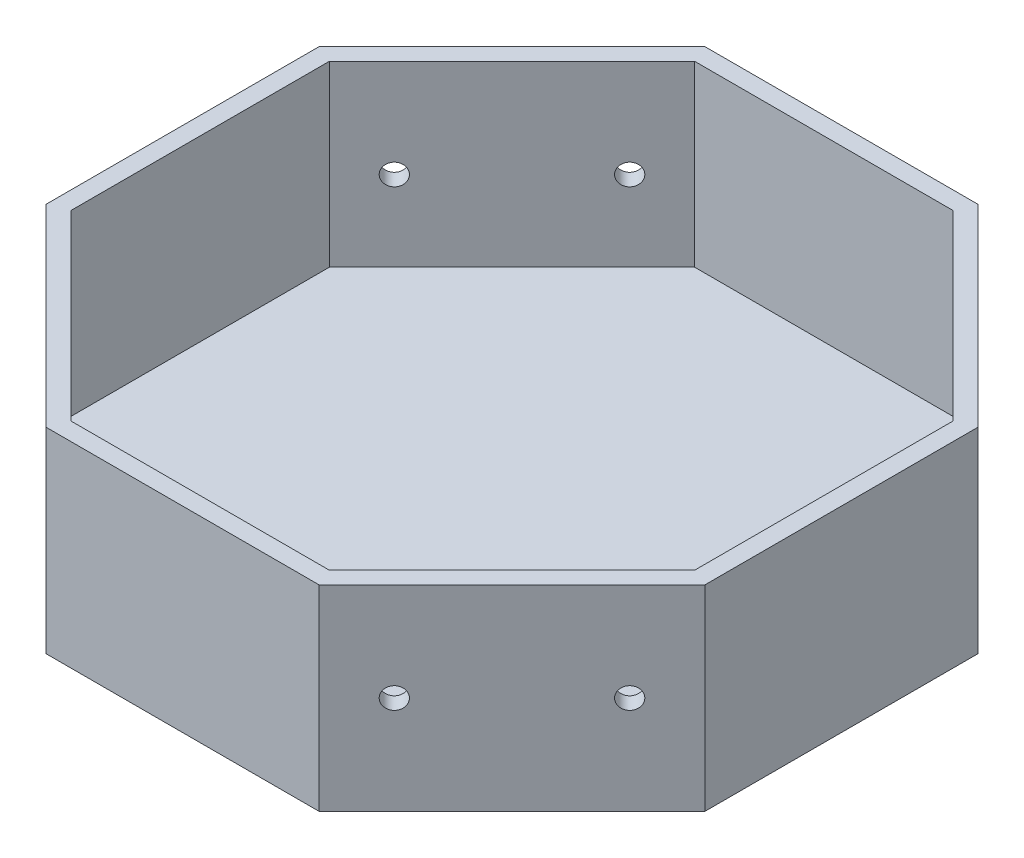
ISO-10303-21;
HEADER;
FILE_DESCRIPTION(('STEP AP214'),'2;1');
FILE_NAME('part.step','',(''),(''),'','','');
FILE_SCHEMA(('AUTOMOTIVE_DESIGN { 1 0 10303 214 1 1 1 1 }'));
ENDSEC;
DATA;
#1=APPLICATION_CONTEXT('core data for automotive mechanical design processes');
#2=APPLICATION_PROTOCOL_DEFINITION('international standard','automotive_design',2000,#1);
#3=PRODUCT_CONTEXT('',#1,'mechanical');
#4=PRODUCT('Part','Part','',(#3));
#5=PRODUCT_RELATED_PRODUCT_CATEGORY('part','',(#4));
#6=PRODUCT_DEFINITION_FORMATION('','',#4);
#7=PRODUCT_DEFINITION_CONTEXT('part definition',#1,'design');
#8=PRODUCT_DEFINITION('design','',#6,#7);
#9=PRODUCT_DEFINITION_SHAPE('','',#8);
#10=(LENGTH_UNIT() NAMED_UNIT(*) SI_UNIT(.MILLI.,.METRE.));
#11=(NAMED_UNIT(*) PLANE_ANGLE_UNIT() SI_UNIT($,.RADIAN.));
#12=(NAMED_UNIT(*) SI_UNIT($,.STERADIAN.) SOLID_ANGLE_UNIT());
#13=UNCERTAINTY_MEASURE_WITH_UNIT(LENGTH_MEASURE(1.E-05),#10,'distance_accuracy_value','');
#14=(GEOMETRIC_REPRESENTATION_CONTEXT(3) GLOBAL_UNCERTAINTY_ASSIGNED_CONTEXT((#13)) GLOBAL_UNIT_ASSIGNED_CONTEXT((#10,
#11,#12)) REPRESENTATION_CONTEXT('',''));
#15=CARTESIAN_POINT('',(0.,0.,0.));
#16=DIRECTION('',(0.,0.,1.));
#17=DIRECTION('',(1.,0.,0.));
#18=AXIS2_PLACEMENT_3D('',#15,#16,#17);
#19=CARTESIAN_POINT('',(55.4327719506772,3.,22.9610059419054));
#20=DIRECTION('',(-1.,0.,0.));
#21=DIRECTION('',(0.,0.,1.));
#22=AXIS2_PLACEMENT_3D('',#19,#20,#21);
#23=PLANE('',#22);
#24=DIRECTION('',(0.,0.,-1.));
#25=VECTOR('',#24,1.);
#26=CARTESIAN_POINT('',(55.4327719506772,0.,22.9610059419054));
#27=LINE('',#26,#25);
#28=CARTESIAN_POINT('',(55.4327719506772,0.,22.9610059419054));
#29=VERTEX_POINT('',#28);
#30=CARTESIAN_POINT('',(55.4327719506772,0.,-22.9610059419054));
#31=VERTEX_POINT('',#30);
#32=EDGE_CURVE('E243',#29,#31,#27,.T.);
#33=ORIENTED_EDGE('',*,*,#32,.T.);
#34=DIRECTION('',(0.,-1.,0.));
#35=VECTOR('',#34,1.);
#36=CARTESIAN_POINT('',(55.4327719506772,3.,-22.9610059419054));
#37=LINE('',#36,#35);
#38=CARTESIAN_POINT('',(55.4327719506772,33.,-22.9610059419054));
#39=VERTEX_POINT('',#38);
#40=EDGE_CURVE('E11',#39,#31,#37,.T.);
#41=ORIENTED_EDGE('',*,*,#40,.F.);
#42=DIRECTION('',(0.,0.,-1.));
#43=VECTOR('',#42,1.);
#44=CARTESIAN_POINT('',(55.4327719506772,33.,22.9610059419054));
#45=LINE('',#44,#43);
#46=CARTESIAN_POINT('',(55.4327719506772,33.,22.9610059419054));
#47=VERTEX_POINT('',#46);
#48=EDGE_CURVE('E222',#47,#39,#45,.T.);
#49=ORIENTED_EDGE('',*,*,#48,.F.);
#50=DIRECTION('',(0.,-1.,0.));
#51=VECTOR('',#50,1.);
#52=CARTESIAN_POINT('',(55.4327719506772,3.,22.9610059419054));
#53=LINE('',#52,#51);
#54=EDGE_CURVE('E260',#47,#29,#53,.T.);
#55=ORIENTED_EDGE('',*,*,#54,.T.);
#56=EDGE_LOOP('',(#33,#41,#49,#55));
#57=FACE_BOUND('',#56,.T.);
#58=ADVANCED_FACE('F41',(#57),#23,.F.);
#59=CARTESIAN_POINT('',(55.4327719506772,3.,-22.9610059419054));
#60=DIRECTION('',(-0.707106781186547,0.,0.707106781186547));
#61=DIRECTION('',(0.707106781186548,0.,0.707106781186548));
#62=AXIS2_PLACEMENT_3D('',#59,#60,#61);
#63=PLANE('',#62);
#64=CARTESIAN_POINT('',(49.0963838829029,16.5,-29.2973940096798));
#65=DIRECTION('',(0.707106781186545,0.,-0.70710678118655));
#66=DIRECTION('',(-0.70710678118655,0.,-0.707106781186545));
#67=AXIS2_PLACEMENT_3D('',#64,#65,#66);
#68=CIRCLE('',#67,1.8);
#69=CARTESIAN_POINT('',(47.8235916767671,16.5,-30.5701862158156));
#70=VERTEX_POINT('',#69);
#71=EDGE_CURVE('E409',#70,#70,#68,.T.);
#72=ORIENTED_EDGE('',*,*,#71,.F.);
#73=EDGE_LOOP('',(#72));
#74=FACE_BOUND('',#73,.T.);
#75=CARTESIAN_POINT('',(29.2973940096795,16.5,-49.0963838829031));
#76=DIRECTION('',(0.707106781186545,0.,-0.70710678118655));
#77=DIRECTION('',(-0.70710678118655,0.,-0.707106781186545));
#78=AXIS2_PLACEMENT_3D('',#75,#76,#77);
#79=CIRCLE('',#78,1.8);
#80=CARTESIAN_POINT('',(28.0246018035437,16.5,-50.3691760890389));
#81=VERTEX_POINT('',#80);
#82=EDGE_CURVE('E415',#81,#81,#79,.T.);
#83=ORIENTED_EDGE('',*,*,#82,.F.);
#84=EDGE_LOOP('',(#83));
#85=FACE_BOUND('',#84,.T.);
#86=DIRECTION('',(-0.707106781186548,0.,-0.707106781186548));
#87=VECTOR('',#86,1.);
#88=CARTESIAN_POINT('',(55.4327719506772,0.,-22.9610059419054));
#89=LINE('',#88,#87);
#90=CARTESIAN_POINT('',(22.9610059419054,0.,-55.4327719506772));
#91=VERTEX_POINT('',#90);
#92=EDGE_CURVE('E246',#31,#91,#89,.T.);
#93=ORIENTED_EDGE('',*,*,#92,.T.);
#94=DIRECTION('',(0.,-1.,0.));
#95=VECTOR('',#94,1.);
#96=CARTESIAN_POINT('',(22.9610059419054,3.,-55.4327719506772));
#97=LINE('',#96,#95);
#98=CARTESIAN_POINT('',(22.9610059419054,33.,-55.4327719506772));
#99=VERTEX_POINT('',#98);
#100=EDGE_CURVE('E48',#99,#91,#97,.T.);
#101=ORIENTED_EDGE('',*,*,#100,.F.);
#102=DIRECTION('',(-0.707106781186548,0.,-0.707106781186548));
#103=VECTOR('',#102,1.);
#104=CARTESIAN_POINT('',(55.4327719506772,33.,-22.9610059419054));
#105=LINE('',#104,#103);
#106=EDGE_CURVE('E225',#39,#99,#105,.T.);
#107=ORIENTED_EDGE('',*,*,#106,.F.);
#108=ORIENTED_EDGE('',*,*,#40,.T.);
#109=EDGE_LOOP('',(#93,#101,#107,#108));
#110=FACE_BOUND('',#109,.T.);
#111=ADVANCED_FACE('F310',(#74,#85,#110),#63,.F.);
#112=CARTESIAN_POINT('',(22.9610059419054,3.,-55.4327719506772));
#113=DIRECTION('',(0.,0.,1.));
#114=DIRECTION('',(1.,0.,0.));
#115=AXIS2_PLACEMENT_3D('',#112,#113,#114);
#116=PLANE('',#115);
#117=DIRECTION('',(-1.,0.,0.));
#118=VECTOR('',#117,1.);
#119=CARTESIAN_POINT('',(22.9610059419054,0.,-55.4327719506772));
#120=LINE('',#119,#118);
#121=CARTESIAN_POINT('',(-22.9610059419054,0.,-55.4327719506772));
#122=VERTEX_POINT('',#121);
#123=EDGE_CURVE('E248',#91,#122,#120,.T.);
#124=ORIENTED_EDGE('',*,*,#123,.T.);
#125=DIRECTION('',(0.,-1.,0.));
#126=VECTOR('',#125,1.);
#127=CARTESIAN_POINT('',(-22.9610059419054,3.,-55.4327719506772));
#128=LINE('',#127,#126);
#129=CARTESIAN_POINT('',(-22.9610059419054,33.,-55.4327719506772));
#130=VERTEX_POINT('',#129);
#131=EDGE_CURVE('E275',#130,#122,#128,.T.);
#132=ORIENTED_EDGE('',*,*,#131,.F.);
#133=DIRECTION('',(-1.,0.,0.));
#134=VECTOR('',#133,1.);
#135=CARTESIAN_POINT('',(22.9610059419054,33.,-55.4327719506772));
#136=LINE('',#135,#134);
#137=EDGE_CURVE('E228',#99,#130,#136,.T.);
#138=ORIENTED_EDGE('',*,*,#137,.F.);
#139=ORIENTED_EDGE('',*,*,#100,.T.);
#140=EDGE_LOOP('',(#124,#132,#138,#139));
#141=FACE_BOUND('',#140,.T.);
#142=ADVANCED_FACE('F281',(#141),#116,.F.);
#143=CARTESIAN_POINT('',(-22.9610059419054,3.,-55.4327719506772));
#144=DIRECTION('',(0.707106781186548,0.,0.707106781186547));
#145=DIRECTION('',(0.707106781186547,0.,-0.707106781186548));
#146=AXIS2_PLACEMENT_3D('',#143,#144,#145);
#147=PLANE('',#146);
#148=CARTESIAN_POINT('',(-29.2973940096796,16.5,-49.096383882903));
#149=DIRECTION('',(-0.707106781186548,0.,-0.707106781186547));
#150=DIRECTION('',(-0.707106781186547,0.,0.707106781186548));
#151=AXIS2_PLACEMENT_3D('',#148,#149,#150);
#152=CIRCLE('',#151,1.8);
#153=CARTESIAN_POINT('',(-30.5701862158154,16.5,-47.8235916767672));
#154=VERTEX_POINT('',#153);
#155=EDGE_CURVE('E421',#154,#154,#152,.T.);
#156=ORIENTED_EDGE('',*,*,#155,.F.);
#157=EDGE_LOOP('',(#156));
#158=FACE_BOUND('',#157,.T.);
#159=CARTESIAN_POINT('',(-49.096383882903,16.5,-29.2973940096796));
#160=DIRECTION('',(-0.707106781186548,0.,-0.707106781186547));
#161=DIRECTION('',(-0.707106781186547,0.,0.707106781186548));
#162=AXIS2_PLACEMENT_3D('',#159,#160,#161);
#163=CIRCLE('',#162,1.8);
#164=CARTESIAN_POINT('',(-50.3691760890388,16.5,-28.0246018035438));
#165=VERTEX_POINT('',#164);
#166=EDGE_CURVE('E429',#165,#165,#163,.T.);
#167=ORIENTED_EDGE('',*,*,#166,.F.);
#168=EDGE_LOOP('',(#167));
#169=FACE_BOUND('',#168,.T.);
#170=DIRECTION('',(-0.707106781186547,0.,0.707106781186548));
#171=VECTOR('',#170,1.);
#172=CARTESIAN_POINT('',(-22.9610059419054,0.,-55.4327719506772));
#173=LINE('',#172,#171);
#174=CARTESIAN_POINT('',(-55.4327719506772,0.,-22.9610059419054));
#175=VERTEX_POINT('',#174);
#176=EDGE_CURVE('E250',#122,#175,#173,.T.);
#177=ORIENTED_EDGE('',*,*,#176,.T.);
#178=DIRECTION('',(0.,-1.,0.));
#179=VECTOR('',#178,1.);
#180=CARTESIAN_POINT('',(-55.4327719506772,3.,-22.9610059419054));
#181=LINE('',#180,#179);
#182=CARTESIAN_POINT('',(-55.4327719506772,33.,-22.9610059419054));
#183=VERTEX_POINT('',#182);
#184=EDGE_CURVE('E272',#183,#175,#181,.T.);
#185=ORIENTED_EDGE('',*,*,#184,.F.);
#186=DIRECTION('',(-0.707106781186547,0.,0.707106781186548));
#187=VECTOR('',#186,1.);
#188=CARTESIAN_POINT('',(-22.9610059419054,33.,-55.4327719506772));
#189=LINE('',#188,#187);
#190=EDGE_CURVE('E231',#130,#183,#189,.T.);
#191=ORIENTED_EDGE('',*,*,#190,.F.);
#192=ORIENTED_EDGE('',*,*,#131,.T.);
#193=EDGE_LOOP('',(#177,#185,#191,#192));
#194=FACE_BOUND('',#193,.T.);
#195=ADVANCED_FACE('F291',(#158,#169,#194),#147,.F.);
#196=CARTESIAN_POINT('',(-55.4327719506772,3.,-22.9610059419054));
#197=DIRECTION('',(1.,0.,0.));
#198=DIRECTION('',(0.,0.,-1.));
#199=AXIS2_PLACEMENT_3D('',#196,#197,#198);
#200=PLANE('',#199);
#201=DIRECTION('',(0.,0.,1.));
#202=VECTOR('',#201,1.);
#203=CARTESIAN_POINT('',(-55.4327719506772,0.,-22.9610059419054));
#204=LINE('',#203,#202);
#205=CARTESIAN_POINT('',(-55.4327719506772,0.,22.9610059419054));
#206=VERTEX_POINT('',#205);
#207=EDGE_CURVE('E252',#175,#206,#204,.T.);
#208=ORIENTED_EDGE('',*,*,#207,.T.);
#209=DIRECTION('',(0.,-1.,0.));
#210=VECTOR('',#209,1.);
#211=CARTESIAN_POINT('',(-55.4327719506772,3.,22.9610059419054));
#212=LINE('',#211,#210);
#213=CARTESIAN_POINT('',(-55.4327719506772,33.,22.9610059419054));
#214=VERTEX_POINT('',#213);
#215=EDGE_CURVE('E269',#214,#206,#212,.T.);
#216=ORIENTED_EDGE('',*,*,#215,.F.);
#217=DIRECTION('',(0.,0.,1.));
#218=VECTOR('',#217,1.);
#219=CARTESIAN_POINT('',(-55.4327719506772,33.,-22.9610059419054));
#220=LINE('',#219,#218);
#221=EDGE_CURVE('E234',#183,#214,#220,.T.);
#222=ORIENTED_EDGE('',*,*,#221,.F.);
#223=ORIENTED_EDGE('',*,*,#184,.T.);
#224=EDGE_LOOP('',(#208,#216,#222,#223));
#225=FACE_BOUND('',#224,.T.);
#226=ADVANCED_FACE('F295',(#225),#200,.F.);
#227=CARTESIAN_POINT('',(-55.4327719506772,3.,22.9610059419054));
#228=DIRECTION('',(0.707106781186547,0.,-0.707106781186548));
#229=DIRECTION('',(-0.707106781186548,0.,-0.707106781186547));
#230=AXIS2_PLACEMENT_3D('',#227,#228,#229);
#231=PLANE('',#230);
#232=CARTESIAN_POINT('',(-49.0963838829027,16.5,29.2973940096802));
#233=DIRECTION('',(-0.70710678118654,0.,0.707106781186555));
#234=DIRECTION('',(0.707106781186555,0.,0.70710678118654));
#235=AXIS2_PLACEMENT_3D('',#232,#233,#234);
#236=CIRCLE('',#235,1.8);
#237=CARTESIAN_POINT('',(-47.8235916767669,16.5,30.5701862158159));
#238=VERTEX_POINT('',#237);
#239=EDGE_CURVE('E435',#238,#238,#236,.T.);
#240=ORIENTED_EDGE('',*,*,#239,.F.);
#241=EDGE_LOOP('',(#240));
#242=FACE_BOUND('',#241,.T.);
#243=CARTESIAN_POINT('',(-29.2973940096791,16.5,49.0963838829033));
#244=DIRECTION('',(-0.70710678118654,0.,0.707106781186555));
#245=DIRECTION('',(0.707106781186555,0.,0.70710678118654));
#246=AXIS2_PLACEMENT_3D('',#243,#244,#245);
#247=CIRCLE('',#246,1.8);
#248=CARTESIAN_POINT('',(-28.0246018035433,16.5,50.3691760890391));
#249=VERTEX_POINT('',#248);
#250=EDGE_CURVE('E441',#249,#249,#247,.T.);
#251=ORIENTED_EDGE('',*,*,#250,.F.);
#252=EDGE_LOOP('',(#251));
#253=FACE_BOUND('',#252,.T.);
#254=DIRECTION('',(0.707106781186548,0.,0.707106781186547));
#255=VECTOR('',#254,1.);
#256=CARTESIAN_POINT('',(-55.4327719506772,0.,22.9610059419054));
#257=LINE('',#256,#255);
#258=CARTESIAN_POINT('',(-22.9610059419053,0.,55.4327719506772));
#259=VERTEX_POINT('',#258);
#260=EDGE_CURVE('E254',#206,#259,#257,.T.);
#261=ORIENTED_EDGE('',*,*,#260,.T.);
#262=DIRECTION('',(0.,-1.,0.));
#263=VECTOR('',#262,1.);
#264=CARTESIAN_POINT('',(-22.9610059419053,3.,55.4327719506772));
#265=LINE('',#264,#263);
#266=CARTESIAN_POINT('',(-22.9610059419053,33.,55.4327719506772));
#267=VERTEX_POINT('',#266);
#268=EDGE_CURVE('E266',#267,#259,#265,.T.);
#269=ORIENTED_EDGE('',*,*,#268,.F.);
#270=DIRECTION('',(0.707106781186548,0.,0.707106781186547));
#271=VECTOR('',#270,1.);
#272=CARTESIAN_POINT('',(-55.4327719506772,33.,22.9610059419054));
#273=LINE('',#272,#271);
#274=EDGE_CURVE('E237',#214,#267,#273,.T.);
#275=ORIENTED_EDGE('',*,*,#274,.F.);
#276=ORIENTED_EDGE('',*,*,#215,.T.);
#277=EDGE_LOOP('',(#261,#269,#275,#276));
#278=FACE_BOUND('',#277,.T.);
#279=ADVANCED_FACE('F300',(#242,#253,#278),#231,.F.);
#280=CARTESIAN_POINT('',(-22.9610059419053,3.,55.4327719506772));
#281=DIRECTION('',(0.,0.,-1.));
#282=DIRECTION('',(-1.,0.,0.));
#283=AXIS2_PLACEMENT_3D('',#280,#281,#282);
#284=PLANE('',#283);
#285=DIRECTION('',(1.,0.,0.));
#286=VECTOR('',#285,1.);
#287=CARTESIAN_POINT('',(-22.9610059419053,0.,55.4327719506772));
#288=LINE('',#287,#286);
#289=CARTESIAN_POINT('',(22.9610059419054,0.,55.4327719506772));
#290=VERTEX_POINT('',#289);
#291=EDGE_CURVE('E256',#259,#290,#288,.T.);
#292=ORIENTED_EDGE('',*,*,#291,.T.);
#293=DIRECTION('',(0.,-1.,0.));
#294=VECTOR('',#293,1.);
#295=CARTESIAN_POINT('',(22.9610059419054,3.,55.4327719506772));
#296=LINE('',#295,#294);
#297=CARTESIAN_POINT('',(22.9610059419054,33.,55.4327719506772));
#298=VERTEX_POINT('',#297);
#299=EDGE_CURVE('E263',#298,#290,#296,.T.);
#300=ORIENTED_EDGE('',*,*,#299,.F.);
#301=DIRECTION('',(1.,0.,0.));
#302=VECTOR('',#301,1.);
#303=CARTESIAN_POINT('',(-22.9610059419053,33.,55.4327719506772));
#304=LINE('',#303,#302);
#305=EDGE_CURVE('E240',#267,#298,#304,.T.);
#306=ORIENTED_EDGE('',*,*,#305,.F.);
#307=ORIENTED_EDGE('',*,*,#268,.T.);
#308=EDGE_LOOP('',(#292,#300,#306,#307));
#309=FACE_BOUND('',#308,.T.);
#310=ADVANCED_FACE('F303',(#309),#284,.F.);
#311=CARTESIAN_POINT('',(22.9610059419054,3.,55.4327719506772));
#312=DIRECTION('',(-0.707106781186548,0.,-0.707106781186547));
#313=DIRECTION('',(-0.707106781186547,0.,0.707106781186548));
#314=AXIS2_PLACEMENT_3D('',#311,#312,#313);
#315=PLANE('',#314);
#316=CARTESIAN_POINT('',(29.2973940096796,16.5,49.096383882903));
#317=DIRECTION('',(0.707106781186548,0.,0.707106781186547));
#318=DIRECTION('',(0.707106781186547,0.,-0.707106781186548));
#319=AXIS2_PLACEMENT_3D('',#316,#317,#318);
#320=CIRCLE('',#319,1.8);
#321=CARTESIAN_POINT('',(30.5701862158154,16.5,47.8235916767672));
#322=VERTEX_POINT('',#321);
#323=EDGE_CURVE('E190',#322,#322,#320,.T.);
#324=ORIENTED_EDGE('',*,*,#323,.F.);
#325=EDGE_LOOP('',(#324));
#326=FACE_BOUND('',#325,.T.);
#327=CARTESIAN_POINT('',(49.096383882903,16.5,29.2973940096796));
#328=DIRECTION('',(0.707106781186548,0.,0.707106781186547));
#329=DIRECTION('',(0.707106781186547,0.,-0.707106781186548));
#330=AXIS2_PLACEMENT_3D('',#327,#328,#329);
#331=CIRCLE('',#330,1.8);
#332=CARTESIAN_POINT('',(50.3691760890388,16.5,28.0246018035438));
#333=VERTEX_POINT('',#332);
#334=EDGE_CURVE('E410',#333,#333,#331,.T.);
#335=ORIENTED_EDGE('',*,*,#334,.F.);
#336=EDGE_LOOP('',(#335));
#337=FACE_BOUND('',#336,.T.);
#338=DIRECTION('',(0.707106781186547,0.,-0.707106781186548));
#339=VECTOR('',#338,1.);
#340=CARTESIAN_POINT('',(22.9610059419054,0.,55.4327719506772));
#341=LINE('',#340,#339);
#342=EDGE_CURVE('E258',#290,#29,#341,.T.);
#343=ORIENTED_EDGE('',*,*,#342,.T.);
#344=ORIENTED_EDGE('',*,*,#54,.F.);
#345=DIRECTION('',(0.707106781186547,0.,-0.707106781186548));
#346=VECTOR('',#345,1.);
#347=CARTESIAN_POINT('',(22.9610059419054,33.,55.4327719506772));
#348=LINE('',#347,#346);
#349=EDGE_CURVE('E167',#298,#47,#348,.T.);
#350=ORIENTED_EDGE('',*,*,#349,.F.);
#351=ORIENTED_EDGE('',*,*,#299,.T.);
#352=EDGE_LOOP('',(#343,#344,#350,#351));
#353=FACE_BOUND('',#352,.T.);
#354=ADVANCED_FACE('F306',(#326,#337,#353),#315,.F.);
#355=CARTESIAN_POINT('',(0.,0.,0.));
#356=DIRECTION('',(0.,1.,0.));
#357=DIRECTION('',(0.,0.,1.));
#358=AXIS2_PLACEMENT_3D('',#355,#356,#357);
#359=PLANE('',#358);
#360=ORIENTED_EDGE('',*,*,#32,.F.);
#361=ORIENTED_EDGE('',*,*,#342,.F.);
#362=ORIENTED_EDGE('',*,*,#291,.F.);
#363=ORIENTED_EDGE('',*,*,#260,.F.);
#364=ORIENTED_EDGE('',*,*,#207,.F.);
#365=ORIENTED_EDGE('',*,*,#176,.F.);
#366=ORIENTED_EDGE('',*,*,#123,.F.);
#367=ORIENTED_EDGE('',*,*,#92,.F.);
#368=EDGE_LOOP('',(#360,#361,#362,#363,#364,#365,#366,#367));
#369=FACE_BOUND('',#368,.T.);
#370=ADVANCED_FACE('F287',(#369),#359,.F.);
#371=CARTESIAN_POINT('',(0.,33.,0.));
#372=DIRECTION('',(0.,1.,0.));
#373=DIRECTION('',(0.,0.,1.));
#374=AXIS2_PLACEMENT_3D('',#371,#372,#373);
#375=PLANE('',#374);
#376=ORIENTED_EDGE('',*,*,#349,.T.);
#377=ORIENTED_EDGE('',*,*,#48,.T.);
#378=ORIENTED_EDGE('',*,*,#106,.T.);
#379=ORIENTED_EDGE('',*,*,#137,.T.);
#380=ORIENTED_EDGE('',*,*,#190,.T.);
#381=ORIENTED_EDGE('',*,*,#221,.T.);
#382=ORIENTED_EDGE('',*,*,#274,.T.);
#383=ORIENTED_EDGE('',*,*,#305,.T.);
#384=EDGE_LOOP('',(#376,#377,#378,#379,#380,#381,#382,#383));
#385=FACE_BOUND('',#384,.T.);
#386=DIRECTION('',(0.,0.,-1.));
#387=VECTOR('',#386,1.);
#388=CARTESIAN_POINT('',(52.4327719506772,33.,21.7183652547861));
#389=LINE('',#388,#387);
#390=CARTESIAN_POINT('',(52.4327719506772,33.,21.7183652547861));
#391=VERTEX_POINT('',#390);
#392=CARTESIAN_POINT('',(52.4327719506772,33.,-21.7183652547861));
#393=VERTEX_POINT('',#392);
#394=EDGE_CURVE('E161',#391,#393,#389,.T.);
#395=ORIENTED_EDGE('',*,*,#394,.F.);
#396=DIRECTION('',(0.707106781186547,0.,-0.707106781186548));
#397=VECTOR('',#396,1.);
#398=CARTESIAN_POINT('',(21.7183652547861,33.,52.4327719506772));
#399=LINE('',#398,#397);
#400=CARTESIAN_POINT('',(21.7183652547861,33.,52.4327719506772));
#401=VERTEX_POINT('',#400);
#402=EDGE_CURVE('E152',#401,#391,#399,.T.);
#403=ORIENTED_EDGE('',*,*,#402,.F.);
#404=DIRECTION('',(1.,0.,0.));
#405=VECTOR('',#404,1.);
#406=CARTESIAN_POINT('',(-21.7183652547861,33.,52.4327719506772));
#407=LINE('',#406,#405);
#408=CARTESIAN_POINT('',(-21.7183652547861,33.,52.4327719506772));
#409=VERTEX_POINT('',#408);
#410=EDGE_CURVE('E187',#409,#401,#407,.T.);
#411=ORIENTED_EDGE('',*,*,#410,.F.);
#412=DIRECTION('',(0.707106781186548,0.,0.707106781186547));
#413=VECTOR('',#412,1.);
#414=CARTESIAN_POINT('',(-52.4327719506772,33.,21.7183652547861));
#415=LINE('',#414,#413);
#416=CARTESIAN_POINT('',(-52.4327719506772,33.,21.7183652547861));
#417=VERTEX_POINT('',#416);
#418=EDGE_CURVE('E184',#417,#409,#415,.T.);
#419=ORIENTED_EDGE('',*,*,#418,.F.);
#420=DIRECTION('',(0.,0.,1.));
#421=VECTOR('',#420,1.);
#422=CARTESIAN_POINT('',(-52.4327719506772,33.,-21.7183652547861));
#423=LINE('',#422,#421);
#424=CARTESIAN_POINT('',(-52.4327719506772,33.,-21.7183652547861));
#425=VERTEX_POINT('',#424);
#426=EDGE_CURVE('E182',#425,#417,#423,.T.);
#427=ORIENTED_EDGE('',*,*,#426,.F.);
#428=DIRECTION('',(-0.707106781186547,0.,0.707106781186548));
#429=VECTOR('',#428,1.);
#430=CARTESIAN_POINT('',(-21.7183652547861,33.,-52.4327719506772));
#431=LINE('',#430,#429);
#432=CARTESIAN_POINT('',(-21.7183652547861,33.,-52.4327719506772));
#433=VERTEX_POINT('',#432);
#434=EDGE_CURVE('E180',#433,#425,#431,.T.);
#435=ORIENTED_EDGE('',*,*,#434,.F.);
#436=DIRECTION('',(-1.,0.,0.));
#437=VECTOR('',#436,1.);
#438=CARTESIAN_POINT('',(21.7183652547861,33.,-52.4327719506772));
#439=LINE('',#438,#437);
#440=CARTESIAN_POINT('',(21.7183652547861,33.,-52.4327719506772));
#441=VERTEX_POINT('',#440);
#442=EDGE_CURVE('E175',#441,#433,#439,.T.);
#443=ORIENTED_EDGE('',*,*,#442,.F.);
#444=DIRECTION('',(-0.707106781186548,0.,-0.707106781186548));
#445=VECTOR('',#444,1.);
#446=CARTESIAN_POINT('',(52.4327719506772,33.,-21.7183652547861));
#447=LINE('',#446,#445);
#448=EDGE_CURVE('E173',#393,#441,#447,.T.);
#449=ORIENTED_EDGE('',*,*,#448,.F.);
#450=EDGE_LOOP('',(#395,#403,#411,#419,#427,#435,#443,#449));
#451=FACE_BOUND('',#450,.T.);
#452=ADVANCED_FACE('F171',(#385,#451),#375,.T.);
#453=CARTESIAN_POINT('',(21.7183652547861,33.,52.4327719506772));
#454=DIRECTION('',(-0.707106781186548,0.,-0.707106781186547));
#455=DIRECTION('',(-0.707106781186547,0.,0.707106781186548));
#456=AXIS2_PLACEMENT_3D('',#453,#454,#455);
#457=PLANE('',#456);
#458=CARTESIAN_POINT('',(27.17607366612,16.5,46.9750635393433));
#459=DIRECTION('',(-0.707106781186548,0.,-0.707106781186547));
#460=DIRECTION('',(-0.707106781186547,0.,0.707106781186548));
#461=AXIS2_PLACEMENT_3D('',#458,#459,#460);
#462=CIRCLE('',#461,1.8);
#463=CARTESIAN_POINT('',(25.9032814599842,16.5,48.2478557454791));
#464=VERTEX_POINT('',#463);
#465=EDGE_CURVE('E447',#464,#464,#462,.F.);
#466=ORIENTED_EDGE('',*,*,#465,.T.);
#467=EDGE_LOOP('',(#466));
#468=FACE_BOUND('',#467,.T.);
#469=CARTESIAN_POINT('',(46.9750635393433,16.5,27.17607366612));
#470=DIRECTION('',(-0.707106781186548,0.,-0.707106781186547));
#471=DIRECTION('',(-0.707106781186547,0.,0.707106781186548));
#472=AXIS2_PLACEMENT_3D('',#469,#470,#471);
#473=CIRCLE('',#472,1.8);
#474=CARTESIAN_POINT('',(45.7022713332076,16.5,28.4488658722558));
#475=VERTEX_POINT('',#474);
#476=EDGE_CURVE('E413',#475,#475,#473,.F.);
#477=ORIENTED_EDGE('',*,*,#476,.T.);
#478=EDGE_LOOP('',(#477));
#479=FACE_BOUND('',#478,.T.);
#480=DIRECTION('',(0.707106781186547,0.,-0.707106781186548));
#481=VECTOR('',#480,1.);
#482=CARTESIAN_POINT('',(21.7183652547861,3.,52.4327719506772));
#483=LINE('',#482,#481);
#484=CARTESIAN_POINT('',(21.7183652547861,3.,52.4327719506772));
#485=VERTEX_POINT('',#484);
#486=CARTESIAN_POINT('',(52.4327719506772,3.,21.7183652547861));
#487=VERTEX_POINT('',#486);
#488=EDGE_CURVE('E55',#485,#487,#483,.T.);
#489=ORIENTED_EDGE('',*,*,#488,.F.);
#490=DIRECTION('',(0.,-1.,0.));
#491=VECTOR('',#490,1.);
#492=CARTESIAN_POINT('',(21.7183652547861,33.,52.4327719506772));
#493=LINE('',#492,#491);
#494=EDGE_CURVE('E157',#401,#485,#493,.T.);
#495=ORIENTED_EDGE('',*,*,#494,.F.);
#496=ORIENTED_EDGE('',*,*,#402,.T.);
#497=DIRECTION('',(0.,-1.,0.));
#498=VECTOR('',#497,1.);
#499=CARTESIAN_POINT('',(52.4327719506772,33.,21.7183652547861));
#500=LINE('',#499,#498);
#501=EDGE_CURVE('E155',#391,#487,#500,.T.);
#502=ORIENTED_EDGE('',*,*,#501,.T.);
#503=EDGE_LOOP('',(#489,#495,#496,#502));
#504=FACE_BOUND('',#503,.T.);
#505=ADVANCED_FACE('F154',(#468,#479,#504),#457,.T.);
#506=CARTESIAN_POINT('',(52.4327719506772,33.,21.7183652547861));
#507=DIRECTION('',(-1.,0.,0.));
#508=DIRECTION('',(0.,0.,1.));
#509=AXIS2_PLACEMENT_3D('',#506,#507,#508);
#510=PLANE('',#509);
#511=DIRECTION('',(0.,0.,-1.));
#512=VECTOR('',#511,1.);
#513=CARTESIAN_POINT('',(52.4327719506772,3.,21.7183652547861));
#514=LINE('',#513,#512);
#515=CARTESIAN_POINT('',(52.4327719506772,3.,-21.7183652547861));
#516=VERTEX_POINT('',#515);
#517=EDGE_CURVE('E59',#487,#516,#514,.T.);
#518=ORIENTED_EDGE('',*,*,#517,.F.);
#519=ORIENTED_EDGE('',*,*,#501,.F.);
#520=ORIENTED_EDGE('',*,*,#394,.T.);
#521=DIRECTION('',(0.,-1.,0.));
#522=VECTOR('',#521,1.);
#523=CARTESIAN_POINT('',(52.4327719506772,33.,-21.7183652547861));
#524=LINE('',#523,#522);
#525=EDGE_CURVE('E168',#393,#516,#524,.T.);
#526=ORIENTED_EDGE('',*,*,#525,.T.);
#527=EDGE_LOOP('',(#518,#519,#520,#526));
#528=FACE_BOUND('',#527,.T.);
#529=ADVANCED_FACE('F165',(#528),#510,.T.);
#530=CARTESIAN_POINT('',(52.4327719506772,33.,-21.7183652547861));
#531=DIRECTION('',(-0.707106781186547,0.,0.707106781186547));
#532=DIRECTION('',(0.707106781186548,0.,0.707106781186548));
#533=AXIS2_PLACEMENT_3D('',#530,#531,#532);
#534=PLANE('',#533);
#535=CARTESIAN_POINT('',(46.9750635393432,16.5,-27.1760736661201));
#536=DIRECTION('',(-0.707106781186547,0.,0.707106781186547));
#537=DIRECTION('',(0.707106781186548,0.,0.707106781186548));
#538=AXIS2_PLACEMENT_3D('',#535,#536,#537);
#539=CIRCLE('',#538,1.8);
#540=CARTESIAN_POINT('',(48.247855745479,16.5,-25.9032814599843));
#541=VERTEX_POINT('',#540);
#542=EDGE_CURVE('E407',#541,#541,#539,.F.);
#543=ORIENTED_EDGE('',*,*,#542,.T.);
#544=EDGE_LOOP('',(#543));
#545=FACE_BOUND('',#544,.T.);
#546=CARTESIAN_POINT('',(27.1760736661199,16.5,-46.9750635393435));
#547=DIRECTION('',(-0.707106781186547,0.,0.707106781186547));
#548=DIRECTION('',(0.707106781186548,0.,0.707106781186548));
#549=AXIS2_PLACEMENT_3D('',#546,#547,#548);
#550=CIRCLE('',#549,1.8);
#551=CARTESIAN_POINT('',(28.4488658722556,16.5,-45.7022713332077));
#552=VERTEX_POINT('',#551);
#553=EDGE_CURVE('E418',#552,#552,#550,.F.);
#554=ORIENTED_EDGE('',*,*,#553,.T.);
#555=EDGE_LOOP('',(#554));
#556=FACE_BOUND('',#555,.T.);
#557=DIRECTION('',(-0.707106781186548,0.,-0.707106781186548));
#558=VECTOR('',#557,1.);
#559=CARTESIAN_POINT('',(52.4327719506772,3.,-21.7183652547861));
#560=LINE('',#559,#558);
#561=CARTESIAN_POINT('',(21.7183652547861,3.,-52.4327719506772));
#562=VERTEX_POINT('',#561);
#563=EDGE_CURVE('E192',#516,#562,#560,.T.);
#564=ORIENTED_EDGE('',*,*,#563,.F.);
#565=ORIENTED_EDGE('',*,*,#525,.F.);
#566=ORIENTED_EDGE('',*,*,#448,.T.);
#567=DIRECTION('',(0.,-1.,0.));
#568=VECTOR('',#567,1.);
#569=CARTESIAN_POINT('',(21.7183652547861,33.,-52.4327719506772));
#570=LINE('',#569,#568);
#571=EDGE_CURVE('E216',#441,#562,#570,.T.);
#572=ORIENTED_EDGE('',*,*,#571,.T.);
#573=EDGE_LOOP('',(#564,#565,#566,#572));
#574=FACE_BOUND('',#573,.T.);
#575=ADVANCED_FACE('F349',(#545,#556,#574),#534,.T.);
#576=CARTESIAN_POINT('',(21.7183652547861,33.,-52.4327719506772));
#577=DIRECTION('',(0.,0.,1.));
#578=DIRECTION('',(1.,0.,0.));
#579=AXIS2_PLACEMENT_3D('',#576,#577,#578);
#580=PLANE('',#579);
#581=DIRECTION('',(-1.,0.,0.));
#582=VECTOR('',#581,1.);
#583=CARTESIAN_POINT('',(21.7183652547861,3.,-52.4327719506772));
#584=LINE('',#583,#582);
#585=CARTESIAN_POINT('',(-21.7183652547861,3.,-52.4327719506772));
#586=VERTEX_POINT('',#585);
#587=EDGE_CURVE('E194',#562,#586,#584,.T.);
#588=ORIENTED_EDGE('',*,*,#587,.F.);
#589=ORIENTED_EDGE('',*,*,#571,.F.);
#590=ORIENTED_EDGE('',*,*,#442,.T.);
#591=DIRECTION('',(0.,-1.,0.));
#592=VECTOR('',#591,1.);
#593=CARTESIAN_POINT('',(-21.7183652547861,33.,-52.4327719506772));
#594=LINE('',#593,#592);
#595=EDGE_CURVE('E213',#433,#586,#594,.T.);
#596=ORIENTED_EDGE('',*,*,#595,.T.);
#597=EDGE_LOOP('',(#588,#589,#590,#596));
#598=FACE_BOUND('',#597,.T.);
#599=ADVANCED_FACE('F352',(#598),#580,.T.);
#600=CARTESIAN_POINT('',(-21.7183652547861,33.,-52.4327719506772));
#601=DIRECTION('',(0.707106781186548,0.,0.707106781186547));
#602=DIRECTION('',(0.707106781186547,0.,-0.707106781186548));
#603=AXIS2_PLACEMENT_3D('',#600,#601,#602);
#604=PLANE('',#603);
#605=CARTESIAN_POINT('',(-27.17607366612,16.5,-46.9750635393433));
#606=DIRECTION('',(0.707106781186548,0.,0.707106781186547));
#607=DIRECTION('',(0.707106781186547,0.,-0.707106781186548));
#608=AXIS2_PLACEMENT_3D('',#605,#606,#607);
#609=CIRCLE('',#608,1.8);
#610=CARTESIAN_POINT('',(-25.9032814599842,16.5,-48.2478557454791));
#611=VERTEX_POINT('',#610);
#612=EDGE_CURVE('E426',#611,#611,#609,.F.);
#613=ORIENTED_EDGE('',*,*,#612,.T.);
#614=EDGE_LOOP('',(#613));
#615=FACE_BOUND('',#614,.T.);
#616=CARTESIAN_POINT('',(-46.9750635393433,16.5,-27.17607366612));
#617=DIRECTION('',(0.707106781186548,0.,0.707106781186547));
#618=DIRECTION('',(0.707106781186547,0.,-0.707106781186548));
#619=AXIS2_PLACEMENT_3D('',#616,#617,#618);
#620=CIRCLE('',#619,1.8);
#621=CARTESIAN_POINT('',(-45.7022713332075,16.5,-28.4488658722558));
#622=VERTEX_POINT('',#621);
#623=EDGE_CURVE('E432',#622,#622,#620,.F.);
#624=ORIENTED_EDGE('',*,*,#623,.T.);
#625=EDGE_LOOP('',(#624));
#626=FACE_BOUND('',#625,.T.);
#627=DIRECTION('',(-0.707106781186547,0.,0.707106781186548));
#628=VECTOR('',#627,1.);
#629=CARTESIAN_POINT('',(-21.7183652547861,3.,-52.4327719506772));
#630=LINE('',#629,#628);
#631=CARTESIAN_POINT('',(-52.4327719506772,3.,-21.7183652547861));
#632=VERTEX_POINT('',#631);
#633=EDGE_CURVE('E196',#586,#632,#630,.T.);
#634=ORIENTED_EDGE('',*,*,#633,.F.);
#635=ORIENTED_EDGE('',*,*,#595,.F.);
#636=ORIENTED_EDGE('',*,*,#434,.T.);
#637=DIRECTION('',(0.,-1.,0.));
#638=VECTOR('',#637,1.);
#639=CARTESIAN_POINT('',(-52.4327719506772,33.,-21.7183652547861));
#640=LINE('',#639,#638);
#641=EDGE_CURVE('E210',#425,#632,#640,.T.);
#642=ORIENTED_EDGE('',*,*,#641,.T.);
#643=EDGE_LOOP('',(#634,#635,#636,#642));
#644=FACE_BOUND('',#643,.T.);
#645=ADVANCED_FACE('F356',(#615,#626,#644),#604,.T.);
#646=CARTESIAN_POINT('',(-52.4327719506772,33.,-21.7183652547861));
#647=DIRECTION('',(1.,0.,0.));
#648=DIRECTION('',(0.,0.,-1.));
#649=AXIS2_PLACEMENT_3D('',#646,#647,#648);
#650=PLANE('',#649);
#651=DIRECTION('',(0.,0.,1.));
#652=VECTOR('',#651,1.);
#653=CARTESIAN_POINT('',(-52.4327719506772,3.,-21.7183652547861));
#654=LINE('',#653,#652);
#655=CARTESIAN_POINT('',(-52.4327719506772,3.,21.7183652547861));
#656=VERTEX_POINT('',#655);
#657=EDGE_CURVE('E198',#632,#656,#654,.T.);
#658=ORIENTED_EDGE('',*,*,#657,.F.);
#659=ORIENTED_EDGE('',*,*,#641,.F.);
#660=ORIENTED_EDGE('',*,*,#426,.T.);
#661=DIRECTION('',(0.,-1.,0.));
#662=VECTOR('',#661,1.);
#663=CARTESIAN_POINT('',(-52.4327719506772,33.,21.7183652547861));
#664=LINE('',#663,#662);
#665=EDGE_CURVE('E207',#417,#656,#664,.T.);
#666=ORIENTED_EDGE('',*,*,#665,.T.);
#667=EDGE_LOOP('',(#658,#659,#660,#666));
#668=FACE_BOUND('',#667,.T.);
#669=ADVANCED_FACE('F360',(#668),#650,.T.);
#670=CARTESIAN_POINT('',(-52.4327719506772,33.,21.7183652547861));
#671=DIRECTION('',(0.707106781186547,0.,-0.707106781186548));
#672=DIRECTION('',(-0.707106781186548,0.,-0.707106781186547));
#673=AXIS2_PLACEMENT_3D('',#670,#671,#672);
#674=PLANE('',#673);
#675=CARTESIAN_POINT('',(-46.9750635393429,16.5,27.1760736661204));
#676=DIRECTION('',(0.707106781186547,0.,-0.707106781186548));
#677=DIRECTION('',(-0.707106781186548,0.,-0.707106781186547));
#678=AXIS2_PLACEMENT_3D('',#675,#676,#677);
#679=CIRCLE('',#678,1.8);
#680=CARTESIAN_POINT('',(-45.7022713332071,16.5,28.4488658722561));
#681=VERTEX_POINT('',#680);
#682=EDGE_CURVE('E438',#681,#681,#679,.F.);
#683=ORIENTED_EDGE('',*,*,#682,.T.);
#684=EDGE_LOOP('',(#683));
#685=FACE_BOUND('',#684,.T.);
#686=CARTESIAN_POINT('',(-27.1760736661196,16.5,46.9750635393437));
#687=DIRECTION('',(0.707106781186547,0.,-0.707106781186548));
#688=DIRECTION('',(-0.707106781186548,0.,-0.707106781186547));
#689=AXIS2_PLACEMENT_3D('',#686,#687,#688);
#690=CIRCLE('',#689,1.8);
#691=CARTESIAN_POINT('',(-25.9032814599838,16.5,48.2478557454795));
#692=VERTEX_POINT('',#691);
#693=EDGE_CURVE('E444',#692,#692,#690,.F.);
#694=ORIENTED_EDGE('',*,*,#693,.T.);
#695=EDGE_LOOP('',(#694));
#696=FACE_BOUND('',#695,.T.);
#697=DIRECTION('',(0.707106781186548,0.,0.707106781186547));
#698=VECTOR('',#697,1.);
#699=CARTESIAN_POINT('',(-52.4327719506772,3.,21.7183652547861));
#700=LINE('',#699,#698);
#701=CARTESIAN_POINT('',(-21.7183652547861,3.,52.4327719506772));
#702=VERTEX_POINT('',#701);
#703=EDGE_CURVE('E200',#656,#702,#700,.T.);
#704=ORIENTED_EDGE('',*,*,#703,.F.);
#705=ORIENTED_EDGE('',*,*,#665,.F.);
#706=ORIENTED_EDGE('',*,*,#418,.T.);
#707=DIRECTION('',(0.,-1.,0.));
#708=VECTOR('',#707,1.);
#709=CARTESIAN_POINT('',(-21.7183652547861,33.,52.4327719506772));
#710=LINE('',#709,#708);
#711=EDGE_CURVE('E204',#409,#702,#710,.T.);
#712=ORIENTED_EDGE('',*,*,#711,.T.);
#713=EDGE_LOOP('',(#704,#705,#706,#712));
#714=FACE_BOUND('',#713,.T.);
#715=ADVANCED_FACE('F364',(#685,#696,#714),#674,.T.);
#716=CARTESIAN_POINT('',(-21.7183652547861,33.,52.4327719506772));
#717=DIRECTION('',(0.,0.,-1.));
#718=DIRECTION('',(-1.,0.,0.));
#719=AXIS2_PLACEMENT_3D('',#716,#717,#718);
#720=PLANE('',#719);
#721=DIRECTION('',(1.,0.,0.));
#722=VECTOR('',#721,1.);
#723=CARTESIAN_POINT('',(-21.7183652547861,3.,52.4327719506772));
#724=LINE('',#723,#722);
#725=EDGE_CURVE('E162',#702,#485,#724,.T.);
#726=ORIENTED_EDGE('',*,*,#725,.F.);
#727=ORIENTED_EDGE('',*,*,#711,.F.);
#728=ORIENTED_EDGE('',*,*,#410,.T.);
#729=ORIENTED_EDGE('',*,*,#494,.T.);
#730=EDGE_LOOP('',(#726,#727,#728,#729));
#731=FACE_BOUND('',#730,.T.);
#732=ADVANCED_FACE('F341',(#731),#720,.T.);
#733=CARTESIAN_POINT('',(0.,3.,0.));
#734=DIRECTION('',(0.,1.,0.));
#735=DIRECTION('',(0.,0.,1.));
#736=AXIS2_PLACEMENT_3D('',#733,#734,#735);
#737=PLANE('',#736);
#738=ORIENTED_EDGE('',*,*,#488,.T.);
#739=ORIENTED_EDGE('',*,*,#517,.T.);
#740=ORIENTED_EDGE('',*,*,#563,.T.);
#741=ORIENTED_EDGE('',*,*,#587,.T.);
#742=ORIENTED_EDGE('',*,*,#633,.T.);
#743=ORIENTED_EDGE('',*,*,#657,.T.);
#744=ORIENTED_EDGE('',*,*,#703,.T.);
#745=ORIENTED_EDGE('',*,*,#725,.T.);
#746=EDGE_LOOP('',(#738,#739,#740,#741,#742,#743,#744,#745));
#747=FACE_BOUND('',#746,.T.);
#748=ADVANCED_FACE('F337',(#747),#737,.T.);
#749=CARTESIAN_POINT('',(-45.5342770140656,16.5,-65.3332668872889));
#750=DIRECTION('',(0.707106781186548,0.,0.707106781186547));
#751=DIRECTION('',(0.707106781186547,0.,-0.707106781186548));
#752=AXIS2_PLACEMENT_3D('',#749,#750,#751);
#753=CYLINDRICAL_SURFACE('',#752,1.8);
#754=ORIENTED_EDGE('',*,*,#476,.F.);
#755=EDGE_LOOP('',(#754));
#756=FACE_BOUND('',#755,.T.);
#757=ORIENTED_EDGE('',*,*,#334,.T.);
#758=EDGE_LOOP('',(#757));
#759=FACE_BOUND('',#758,.T.);
#760=ADVANCED_FACE('F340',(#756,#759),#753,.F.);
#761=CARTESIAN_POINT('',(-65.3332668872889,16.5,-45.5342770140656));
#762=DIRECTION('',(0.707106781186548,0.,0.707106781186547));
#763=DIRECTION('',(0.707106781186547,0.,-0.707106781186548));
#764=AXIS2_PLACEMENT_3D('',#761,#762,#763);
#765=CYLINDRICAL_SURFACE('',#764,1.8);
#766=ORIENTED_EDGE('',*,*,#465,.F.);
#767=EDGE_LOOP('',(#766));
#768=FACE_BOUND('',#767,.T.);
#769=ORIENTED_EDGE('',*,*,#323,.T.);
#770=EDGE_LOOP('',(#769));
#771=FACE_BOUND('',#770,.T.);
#772=ADVANCED_FACE('F374',(#768,#771),#765,.F.);
#773=CARTESIAN_POINT('',(65.3332668872884,16.5,-45.5342770140663));
#774=DIRECTION('',(-0.70710678118654,0.,0.707106781186555));
#775=DIRECTION('',(0.707106781186555,0.,0.70710678118654));
#776=AXIS2_PLACEMENT_3D('',#773,#774,#775);
#777=CYLINDRICAL_SURFACE('',#776,1.8);
#778=CARTESIAN_POINT('',(-25.9032814599838,16.5,48.2478557454795));
#779=CARTESIAN_POINT('',(-25.9253785468959,16.5,48.2699528323916));
#780=CARTESIAN_POINT('',(-25.9474756338079,16.5,48.2920499193036));
#781=CARTESIAN_POINT('',(-25.9916698076321,16.5,48.3362440931278));
#782=CARTESIAN_POINT('',(-26.0137668945442,16.5,48.3583411800399));
#783=CARTESIAN_POINT('',(-26.0579610683683,16.5,48.402535353864));
#784=CARTESIAN_POINT('',(-26.0800581552804,16.5,48.4246324407761));
#785=CARTESIAN_POINT('',(-26.1242523291046,16.5,48.4688266146003));
#786=CARTESIAN_POINT('',(-26.1463494160166,16.5,48.4909237015123));
#787=CARTESIAN_POINT('',(-26.1905435898408,16.5,48.5351178753365));
#788=CARTESIAN_POINT('',(-26.2126406767529,16.5,48.5572149622486));
#789=CARTESIAN_POINT('',(-26.256834850577,16.5,48.6014091360727));
#790=CARTESIAN_POINT('',(-26.2789319374891,16.5,48.6235062229848));
#791=CARTESIAN_POINT('',(-26.3231261113133,16.5,48.667700396809));
#792=CARTESIAN_POINT('',(-26.3452231982253,16.5,48.6897974837211));
#793=CARTESIAN_POINT('',(-26.3894173720495,16.5,48.7339916575452));
#794=CARTESIAN_POINT('',(-26.4115144589616,16.5,48.7560887444573));
#795=CARTESIAN_POINT('',(-26.4557086327857,16.5,48.8002829182814));
#796=CARTESIAN_POINT('',(-26.4778057196978,16.5,48.8223800051935));
#797=CARTESIAN_POINT('',(-26.521999893522,16.5,48.8665741790177));
#798=CARTESIAN_POINT('',(-26.5440969804341,16.5,48.8886712659298));
#799=CARTESIAN_POINT('',(-26.5882911542582,16.5,48.9328654397539));
#800=CARTESIAN_POINT('',(-26.6103882411703,16.5,48.954962526666));
#801=CARTESIAN_POINT('',(-26.6545824149944,16.5,48.9991567004902));
#802=CARTESIAN_POINT('',(-26.6766795019065,16.5,49.0212537874022));
#803=CARTESIAN_POINT('',(-26.7208736757307,16.5,49.0654479612264));
#804=CARTESIAN_POINT('',(-26.7429707626428,16.5,49.0875450481385));
#805=CARTESIAN_POINT('',(-26.7871649364669,16.5,49.1317392219626));
#806=CARTESIAN_POINT('',(-26.809262023379,16.5,49.1538363088747));
#807=CARTESIAN_POINT('',(-26.8534561972031,16.5,49.1980304826989));
#808=CARTESIAN_POINT('',(-26.8755532841152,16.5,49.2201275696109));
#809=CARTESIAN_POINT('',(-26.9197474579394,16.5,49.2643217434351));
#810=CARTESIAN_POINT('',(-26.9418445448515,16.5,49.2864188303472));
#811=CARTESIAN_POINT('',(-26.9860387186756,16.5,49.3306130041713));
#812=CARTESIAN_POINT('',(-27.0081358055877,16.5,49.3527100910834));
#813=CARTESIAN_POINT('',(-27.0523299794119,16.5,49.3969042649076));
#814=CARTESIAN_POINT('',(-27.0744270663239,16.5,49.4190013518197));
#815=CARTESIAN_POINT('',(-27.1186212401481,16.5,49.4631955256438));
#816=CARTESIAN_POINT('',(-27.1407183270602,16.5,49.4852926125559));
#817=CARTESIAN_POINT('',(-27.1849125008843,16.5,49.52948678638));
#818=CARTESIAN_POINT('',(-27.2070095877964,16.5,49.5515838732921));
#819=CARTESIAN_POINT('',(-27.2512037616206,16.5,49.5957780471163));
#820=CARTESIAN_POINT('',(-27.2733008485326,16.5,49.6178751340284));
#821=CARTESIAN_POINT('',(-27.3174950223568,16.5,49.6620693078525));
#822=CARTESIAN_POINT('',(-27.3395921092689,16.5,49.6841663947646));
#823=CARTESIAN_POINT('',(-27.383786283093,16.5,49.7283605685888));
#824=CARTESIAN_POINT('',(-27.4058833700051,16.5,49.7504576555008));
#825=CARTESIAN_POINT('',(-27.4500775438293,16.5,49.794651829325));
#826=CARTESIAN_POINT('',(-27.4721746307414,16.5,49.8167489162371));
#827=CARTESIAN_POINT('',(-27.5163688045655,16.5,49.8609430900612));
#828=CARTESIAN_POINT('',(-27.5384658914776,16.5,49.8830401769733));
#829=CARTESIAN_POINT('',(-27.5826600653018,16.5,49.9272343507975));
#830=CARTESIAN_POINT('',(-27.6047571522138,16.5,49.9493314377096));
#831=CARTESIAN_POINT('',(-27.648951326038,16.5,49.9935256115337));
#832=CARTESIAN_POINT('',(-27.6710484129501,16.5,50.0156226984458));
#833=CARTESIAN_POINT('',(-27.7152425867742,16.5,50.0598168722699));
#834=CARTESIAN_POINT('',(-27.7373396736863,16.5,50.081913959182));
#835=CARTESIAN_POINT('',(-27.7815338475105,16.5,50.1261081330062));
#836=CARTESIAN_POINT('',(-27.8036309344225,16.5,50.1482052199183));
#837=CARTESIAN_POINT('',(-27.8478251082467,16.5,50.1923993937424));
#838=CARTESIAN_POINT('',(-27.8699221951588,16.5,50.2144964806545));
#839=CARTESIAN_POINT('',(-27.9141163689829,16.5,50.2586906544787));
#840=CARTESIAN_POINT('',(-27.936213455895,16.5,50.2807877413907));
#841=CARTESIAN_POINT('',(-27.9804076297192,16.5,50.3249819152149));
#842=CARTESIAN_POINT('',(-28.0025047166312,16.5,50.347079002127));
#843=CARTESIAN_POINT('',(-28.0246018035433,16.5,50.3691760890391));
#844=B_SPLINE_CURVE_WITH_KNOTS('',3,(#778,#779,#780,#781,#782,#783,#784,#785,#786,#787,#788,
#789,#790,#791,#792,#793,#794,#795,#796,#797,#798,#799,#800,#801,#802,#803,#804,#805,#806,#807,
#808,#809,#810,#811,#812,#813,#814,#815,#816,#817,#818,#819,#820,#821,#822,#823,#824,#825,#826,
#827,#828,#829,#830,#831,#832,#833,#834,#835,#836,#837,#838,#839,#840,#841,#842,#843),
.UNSPECIFIED.,.F.,.F.,(4,2,2,2,2,2,2,2,2,2,2,2,2,2,2,2,2,2,2,2,2,2,2,2,2,2,2,2,2,2,2,2,4),(0.,
0.0937500000000033,0.187500000000007,0.281249999999981,0.374999999999984,0.468749999999987,
0.562499999999961,0.656249999999974,0.749999999999968,0.843749999999981,0.937499999999975,
1.03124999999996,1.12499999999995,1.21874999999997,1.31249999999994,1.40624999999993,
1.49999999999995,1.59374999999994,1.68749999999995,1.78124999999993,1.87499999999993,
1.96874999999993,2.06249999999991,2.15624999999991,2.24999999999992,2.34374999999992,
2.43749999999993,2.5312499999999,2.6249999999999,2.71874999999991,2.81249999999989,
2.90624999999989,2.99999999999989),.UNSPECIFIED.);
#845=EDGE_CURVE('BSEAM378',#692,#249,#844,.T.);
#846=ORIENTED_EDGE('',*,*,#693,.F.);
#847=ORIENTED_EDGE('',*,*,#250,.T.);
#848=ORIENTED_EDGE('',*,*,#845,.T.);
#849=ORIENTED_EDGE('',*,*,#845,.F.);
#850=EDGE_LOOP('',(#846,#848,#847,#849));
#851=FACE_BOUND('',#850,.T.);
#852=ADVANCED_FACE('F378',(#851),#777,.F.);
#853=CARTESIAN_POINT('',(45.5342770140649,16.5,-65.3332668872894));
#854=DIRECTION('',(-0.70710678118654,0.,0.707106781186555));
#855=DIRECTION('',(0.707106781186555,0.,0.70710678118654));
#856=AXIS2_PLACEMENT_3D('',#853,#854,#855);
#857=CYLINDRICAL_SURFACE('',#856,1.8);
#858=CARTESIAN_POINT('',(-45.7022713332071,16.5,28.4488658722561));
#859=CARTESIAN_POINT('',(-45.7243684201192,16.5,28.4709629591682));
#860=CARTESIAN_POINT('',(-45.7464655070313,16.5,28.4930600460803));
#861=CARTESIAN_POINT('',(-45.7906596808554,16.5,28.5372542199045));
#862=CARTESIAN_POINT('',(-45.8127567677675,16.5,28.5593513068166));
#863=CARTESIAN_POINT('',(-45.8569509415917,16.5,28.6035454806407));
#864=CARTESIAN_POINT('',(-45.8790480285038,16.5,28.6256425675528));
#865=CARTESIAN_POINT('',(-45.9232422023279,16.5,28.669836741377));
#866=CARTESIAN_POINT('',(-45.94533928924,16.5,28.691933828289));
#867=CARTESIAN_POINT('',(-45.9895334630642,16.5,28.7361280021132));
#868=CARTESIAN_POINT('',(-46.0116305499762,16.5,28.7582250890253));
#869=CARTESIAN_POINT('',(-46.0558247238004,16.5,28.8024192628494));
#870=CARTESIAN_POINT('',(-46.0779218107125,16.5,28.8245163497615));
#871=CARTESIAN_POINT('',(-46.1221159845366,16.5,28.8687105235857));
#872=CARTESIAN_POINT('',(-46.1442130714487,16.5,28.8908076104978));
#873=CARTESIAN_POINT('',(-46.1884072452729,16.5,28.9350017843219));
#874=CARTESIAN_POINT('',(-46.210504332185,16.5,28.957098871234));
#875=CARTESIAN_POINT('',(-46.2546985060091,16.5,29.0012930450582));
#876=CARTESIAN_POINT('',(-46.2767955929212,16.5,29.0233901319703));
#877=CARTESIAN_POINT('',(-46.3209897667454,16.5,29.0675843057944));
#878=CARTESIAN_POINT('',(-46.3430868536575,16.5,29.0896813927065));
#879=CARTESIAN_POINT('',(-46.3872810274816,16.5,29.1338755665307));
#880=CARTESIAN_POINT('',(-46.4093781143937,16.5,29.1559726534427));
#881=CARTESIAN_POINT('',(-46.4535722882179,16.5,29.2001668272669));
#882=CARTESIAN_POINT('',(-46.4756693751299,16.5,29.222263914179));
#883=CARTESIAN_POINT('',(-46.5198635489541,16.5,29.2664580880032));
#884=CARTESIAN_POINT('',(-46.5419606358662,16.5,29.2885551749152));
#885=CARTESIAN_POINT('',(-46.5861548096903,16.5,29.3327493487394));
#886=CARTESIAN_POINT('',(-46.6082518966024,16.5,29.3548464356515));
#887=CARTESIAN_POINT('',(-46.6524460704266,16.5,29.3990406094756));
#888=CARTESIAN_POINT('',(-46.6745431573387,16.5,29.4211376963877));
#889=CARTESIAN_POINT('',(-46.7187373311628,16.5,29.4653318702119));
#890=CARTESIAN_POINT('',(-46.7408344180749,16.5,29.487428957124));
#891=CARTESIAN_POINT('',(-46.7850285918991,16.5,29.5316231309481));
#892=CARTESIAN_POINT('',(-46.8071256788111,16.5,29.5537202178602));
#893=CARTESIAN_POINT('',(-46.8513198526353,16.5,29.5979143916844));
#894=CARTESIAN_POINT('',(-46.8734169395474,16.5,29.6200114785964));
#895=CARTESIAN_POINT('',(-46.9176111133716,16.5,29.6642056524206));
#896=CARTESIAN_POINT('',(-46.9397082002836,16.5,29.6863027393327));
#897=CARTESIAN_POINT('',(-46.9839023741078,16.5,29.7304969131569));
#898=CARTESIAN_POINT('',(-47.0059994610199,16.5,29.7525940000689));
#899=CARTESIAN_POINT('',(-47.050193634844,16.5,29.7967881738931));
#900=CARTESIAN_POINT('',(-47.0722907217561,16.5,29.8188852608052));
#901=CARTESIAN_POINT('',(-47.1164848955803,16.5,29.8630794346293));
#902=CARTESIAN_POINT('',(-47.1385819824924,16.5,29.8851765215414));
#903=CARTESIAN_POINT('',(-47.1827761563165,16.5,29.9293706953656));
#904=CARTESIAN_POINT('',(-47.2048732432286,16.5,29.9514677822777));
#905=CARTESIAN_POINT('',(-47.2490674170528,16.5,29.9956619561018));
#906=CARTESIAN_POINT('',(-47.2711645039648,16.5,30.0177590430139));
#907=CARTESIAN_POINT('',(-47.315358677789,16.5,30.0619532168381));
#908=CARTESIAN_POINT('',(-47.3374557647011,16.5,30.0840503037502));
#909=CARTESIAN_POINT('',(-47.3816499385252,16.5,30.1282444775743));
#910=CARTESIAN_POINT('',(-47.4037470254373,16.5,30.1503415644864));
#911=CARTESIAN_POINT('',(-47.4479411992615,16.5,30.1945357383106));
#912=CARTESIAN_POINT('',(-47.4700382861736,16.5,30.2166328252226));
#913=CARTESIAN_POINT('',(-47.5142324599977,16.5,30.2608269990468));
#914=CARTESIAN_POINT('',(-47.5363295469098,16.5,30.2829240859589));
#915=CARTESIAN_POINT('',(-47.580523720734,16.5,30.3271182597831));
#916=CARTESIAN_POINT('',(-47.6026208076461,16.5,30.3492153466951));
#917=CARTESIAN_POINT('',(-47.6468149814702,16.5,30.3934095205193));
#918=CARTESIAN_POINT('',(-47.6689120683823,16.5,30.4155066074314));
#919=CARTESIAN_POINT('',(-47.7131062422065,16.5,30.4597007812555));
#920=CARTESIAN_POINT('',(-47.7352033291185,16.5,30.4817978681676));
#921=CARTESIAN_POINT('',(-47.7793975029427,16.5,30.5259920419918));
#922=CARTESIAN_POINT('',(-47.8014945898548,16.5,30.5480891289039));
#923=CARTESIAN_POINT('',(-47.8235916767669,16.5,30.5701862158159));
#924=B_SPLINE_CURVE_WITH_KNOTS('',3,(#858,#859,#860,#861,#862,#863,#864,#865,#866,#867,#868,
#869,#870,#871,#872,#873,#874,#875,#876,#877,#878,#879,#880,#881,#882,#883,#884,#885,#886,#887,
#888,#889,#890,#891,#892,#893,#894,#895,#896,#897,#898,#899,#900,#901,#902,#903,#904,#905,#906,
#907,#908,#909,#910,#911,#912,#913,#914,#915,#916,#917,#918,#919,#920,#921,#922,#923),
.UNSPECIFIED.,.F.,.F.,(4,2,2,2,2,2,2,2,2,2,2,2,2,2,2,2,2,2,2,2,2,2,2,2,2,2,2,2,2,2,2,2,4),(0.,
0.0937500000000132,0.187500000000017,0.28125000000001,0.375000000000023,0.468750000000017,
0.56250000000003,0.656250000000023,0.750000000000037,0.843750000000069,0.937500000000063,
1.03125000000008,1.12500000000008,1.21875000000007,1.31250000000009,1.40625000000008,
1.50000000000009,1.59375000000009,1.6875000000001,1.7812500000001,1.87500000000011,
1.96875000000011,2.06250000000011,2.15625000000012,2.25000000000015,2.34375000000014,
2.43750000000016,2.53125000000015,2.62500000000016,2.71875000000017,2.81250000000017,
2.90625000000017,3.00000000000018),.UNSPECIFIED.);
#925=EDGE_CURVE('BSEAM382',#681,#238,#924,.T.);
#926=ORIENTED_EDGE('',*,*,#682,.F.);
#927=ORIENTED_EDGE('',*,*,#239,.T.);
#928=ORIENTED_EDGE('',*,*,#925,.T.);
#929=ORIENTED_EDGE('',*,*,#925,.F.);
#930=EDGE_LOOP('',(#926,#928,#927,#929));
#931=FACE_BOUND('',#930,.T.);
#932=ADVANCED_FACE('F382',(#931),#857,.F.);
#933=CARTESIAN_POINT('',(45.5342770140656,16.5,65.3332668872889));
#934=DIRECTION('',(-0.707106781186548,0.,-0.707106781186547));
#935=DIRECTION('',(-0.707106781186547,0.,0.707106781186548));
#936=AXIS2_PLACEMENT_3D('',#933,#934,#935);
#937=CYLINDRICAL_SURFACE('',#936,1.8);
#938=ORIENTED_EDGE('',*,*,#623,.F.);
#939=EDGE_LOOP('',(#938));
#940=FACE_BOUND('',#939,.T.);
#941=ORIENTED_EDGE('',*,*,#166,.T.);
#942=EDGE_LOOP('',(#941));
#943=FACE_BOUND('',#942,.T.);
#944=ADVANCED_FACE('F386',(#940,#943),#937,.F.);
#945=CARTESIAN_POINT('',(65.3332668872889,16.5,45.5342770140656));
#946=DIRECTION('',(-0.707106781186548,0.,-0.707106781186547));
#947=DIRECTION('',(-0.707106781186547,0.,0.707106781186548));
#948=AXIS2_PLACEMENT_3D('',#945,#946,#947);
#949=CYLINDRICAL_SURFACE('',#948,1.8);
#950=ORIENTED_EDGE('',*,*,#612,.F.);
#951=EDGE_LOOP('',(#950));
#952=FACE_BOUND('',#951,.T.);
#953=ORIENTED_EDGE('',*,*,#155,.T.);
#954=EDGE_LOOP('',(#953));
#955=FACE_BOUND('',#954,.T.);
#956=ADVANCED_FACE('F390',(#952,#955),#949,.F.);
#957=CARTESIAN_POINT('',(-65.3332668872887,16.5,45.5342770140658));
#958=DIRECTION('',(0.707106781186545,0.,-0.70710678118655));
#959=DIRECTION('',(-0.70710678118655,0.,-0.707106781186545));
#960=AXIS2_PLACEMENT_3D('',#957,#958,#959);
#961=CYLINDRICAL_SURFACE('',#960,1.8);
#962=ORIENTED_EDGE('',*,*,#553,.F.);
#963=EDGE_LOOP('',(#962));
#964=FACE_BOUND('',#963,.T.);
#965=ORIENTED_EDGE('',*,*,#82,.T.);
#966=EDGE_LOOP('',(#965));
#967=FACE_BOUND('',#966,.T.);
#968=ADVANCED_FACE('F394',(#964,#967),#961,.F.);
#969=CARTESIAN_POINT('',(-45.5342770140653,16.5,65.3332668872891));
#970=DIRECTION('',(0.707106781186545,0.,-0.70710678118655));
#971=DIRECTION('',(-0.70710678118655,0.,-0.707106781186545));
#972=AXIS2_PLACEMENT_3D('',#969,#970,#971);
#973=CYLINDRICAL_SURFACE('',#972,1.8);
#974=ORIENTED_EDGE('',*,*,#542,.F.);
#975=EDGE_LOOP('',(#974));
#976=FACE_BOUND('',#975,.T.);
#977=ORIENTED_EDGE('',*,*,#71,.T.);
#978=EDGE_LOOP('',(#977));
#979=FACE_BOUND('',#978,.T.);
#980=ADVANCED_FACE('F398',(#976,#979),#973,.F.);
#981=CLOSED_SHELL('',(#58,#111,#142,#195,#226,#279,#310,#354,#370,#452,#505,#529,#575,#599,#645,
#669,#715,#732,#748,#760,#772,#852,#932,#944,#956,#968,#980));
#982=MANIFOLD_SOLID_BREP('B2',#981);
#983=ADVANCED_BREP_SHAPE_REPRESENTATION('',(#18,#982),#14);
#984=SHAPE_DEFINITION_REPRESENTATION(#9,#983);
ENDSEC;
END-ISO-10303-21;
